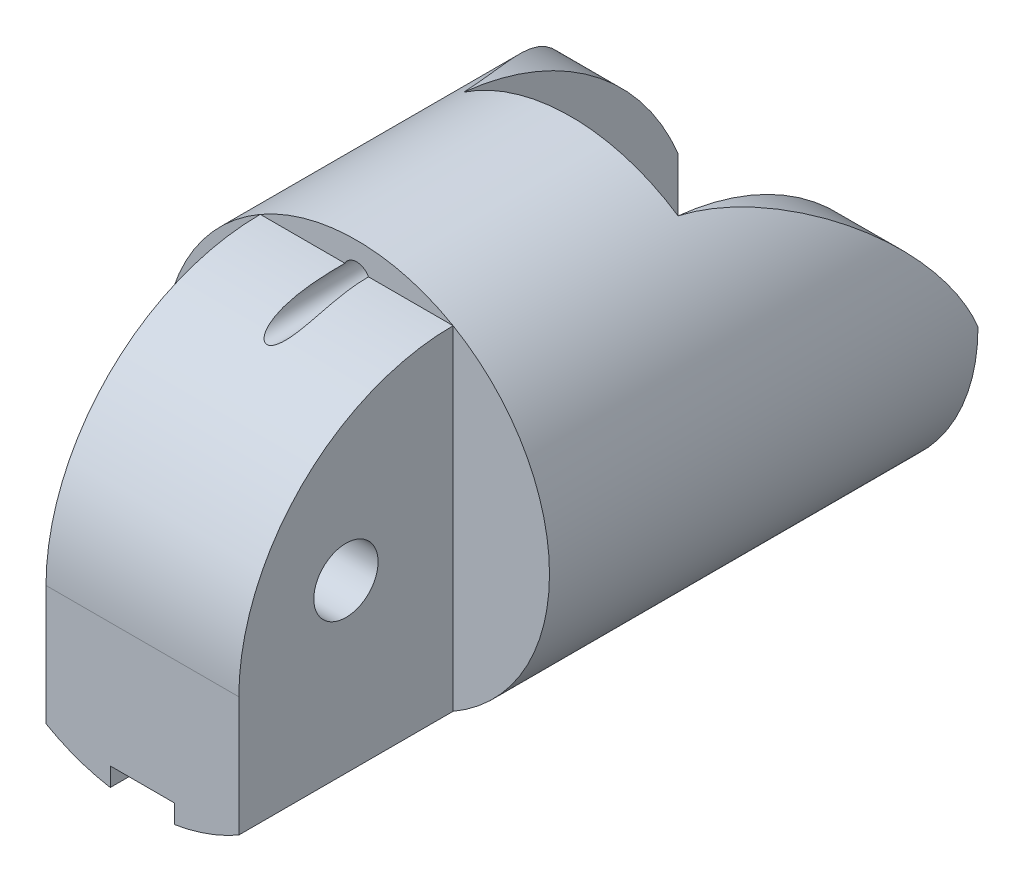
ISO-10303-21;
HEADER;
FILE_DESCRIPTION(('STEP AP214'),'2;1');
FILE_NAME('part.step','',(''),(''),'','','');
FILE_SCHEMA(('AUTOMOTIVE_DESIGN { 1 0 10303 214 1 1 1 1 }'));
ENDSEC;
DATA;
#1=APPLICATION_CONTEXT('core data for automotive mechanical design processes');
#2=APPLICATION_PROTOCOL_DEFINITION('international standard','automotive_design',2000,#1);
#3=PRODUCT_CONTEXT('',#1,'mechanical');
#4=PRODUCT('Part','Part','',(#3));
#5=PRODUCT_RELATED_PRODUCT_CATEGORY('part','',(#4));
#6=PRODUCT_DEFINITION_FORMATION('','',#4);
#7=PRODUCT_DEFINITION_CONTEXT('part definition',#1,'design');
#8=PRODUCT_DEFINITION('design','',#6,#7);
#9=PRODUCT_DEFINITION_SHAPE('','',#8);
#10=(LENGTH_UNIT() NAMED_UNIT(*) SI_UNIT(.MILLI.,.METRE.));
#11=(NAMED_UNIT(*) PLANE_ANGLE_UNIT() SI_UNIT($,.RADIAN.));
#12=(NAMED_UNIT(*) SI_UNIT($,.STERADIAN.) SOLID_ANGLE_UNIT());
#13=UNCERTAINTY_MEASURE_WITH_UNIT(LENGTH_MEASURE(1.E-05),#10,'distance_accuracy_value','');
#14=(GEOMETRIC_REPRESENTATION_CONTEXT(3) GLOBAL_UNCERTAINTY_ASSIGNED_CONTEXT((#13)) GLOBAL_UNIT_ASSIGNED_CONTEXT((#10,
#11,#12)) REPRESENTATION_CONTEXT('',''));
#15=CARTESIAN_POINT('',(0.,0.,0.));
#16=DIRECTION('',(0.,0.,1.));
#17=DIRECTION('',(1.,0.,0.));
#18=AXIS2_PLACEMENT_3D('',#15,#16,#17);
#19=CARTESIAN_POINT('',(0.,0.,0.));
#20=DIRECTION('',(0.,0.,1.));
#21=DIRECTION('',(1.,0.,0.));
#22=AXIS2_PLACEMENT_3D('',#19,#20,#21);
#23=PLANE('',#22);
#24=DIRECTION('',(0.,1.,0.));
#25=VECTOR('',#24,1.);
#26=CARTESIAN_POINT('',(4.5,7.79422863405995,0.));
#27=LINE('',#26,#25);
#28=CARTESIAN_POINT('',(4.5,-7.79422863405995,0.));
#29=VERTEX_POINT('',#28);
#30=CARTESIAN_POINT('',(4.5,7.79422863405995,0.));
#31=VERTEX_POINT('',#30);
#32=EDGE_CURVE('E219',#29,#31,#27,.T.);
#33=ORIENTED_EDGE('',*,*,#32,.F.);
#34=CARTESIAN_POINT('',(0.,0.,0.));
#35=DIRECTION('',(0.,0.,1.));
#36=DIRECTION('',(1.,0.,0.));
#37=AXIS2_PLACEMENT_3D('',#34,#35,#36);
#38=CIRCLE('',#37,9.);
#39=EDGE_CURVE('E202',#29,#31,#38,.T.);
#40=ORIENTED_EDGE('',*,*,#39,.T.);
#41=EDGE_LOOP('',(#33,#40));
#42=FACE_BOUND('',#41,.T.);
#43=ADVANCED_FACE('F40',(#42),#23,.T.);
#44=CARTESIAN_POINT('',(0.,7.5,0.));
#45=DIRECTION('',(0.,0.,1.));
#46=DIRECTION('',(1.,0.,0.));
#47=AXIS2_PLACEMENT_3D('',#44,#45,#46);
#48=CIRCLE('',#47,0.625);
#49=CARTESIAN_POINT('',(0.551411380821269,7.79422863405995,0.));
#50=VERTEX_POINT('',#49);
#51=CARTESIAN_POINT('',(-0.551411380821266,7.79422863405995,0.));
#52=VERTEX_POINT('',#51);
#53=EDGE_CURVE('E67',#50,#52,#48,.T.);
#54=ORIENTED_EDGE('',*,*,#53,.F.);
#55=DIRECTION('',(-1.,0.,0.));
#56=VECTOR('',#55,1.);
#57=CARTESIAN_POINT('',(-4.5,7.79422863405995,0.));
#58=LINE('',#57,#56);
#59=EDGE_CURVE('E226',#31,#50,#58,.T.);
#60=ORIENTED_EDGE('',*,*,#59,.F.);
#61=CARTESIAN_POINT('',(-4.5,7.79422863405995,0.));
#62=VERTEX_POINT('',#61);
#63=EDGE_CURVE('E197',#31,#62,#38,.T.);
#64=ORIENTED_EDGE('',*,*,#63,.T.);
#65=EDGE_CURVE('E229',#52,#62,#58,.T.);
#66=ORIENTED_EDGE('',*,*,#65,.F.);
#67=EDGE_LOOP('',(#54,#60,#64,#66));
#68=FACE_BOUND('',#67,.T.);
#69=ADVANCED_FACE('F290',(#68),#23,.T.);
#70=CARTESIAN_POINT('',(0.,0.,-20.));
#71=DIRECTION('',(0.,0.,1.));
#72=DIRECTION('',(1.,0.,0.));
#73=AXIS2_PLACEMENT_3D('',#70,#71,#72);
#74=PLANE('',#73);
#75=CARTESIAN_POINT('',(0.,0.,-20.));
#76=DIRECTION('',(0.,0.,1.));
#77=DIRECTION('',(1.,0.,0.));
#78=AXIS2_PLACEMENT_3D('',#75,#76,#77);
#79=CIRCLE('',#78,9.);
#80=CARTESIAN_POINT('',(-9.,0.,-20.));
#81=VERTEX_POINT('',#80);
#82=CARTESIAN_POINT('',(-5.,-7.48331477354788,-20.));
#83=VERTEX_POINT('',#82);
#84=EDGE_CURVE('E194',#81,#83,#79,.T.);
#85=ORIENTED_EDGE('',*,*,#84,.F.);
#86=DIRECTION('',(1.,0.,0.));
#87=VECTOR('',#86,1.);
#88=CARTESIAN_POINT('',(-9.,0.,-20.));
#89=LINE('',#88,#87);
#90=CARTESIAN_POINT('',(-5.,0.,-20.));
#91=VERTEX_POINT('',#90);
#92=EDGE_CURVE('E353',#81,#91,#89,.T.);
#93=ORIENTED_EDGE('',*,*,#92,.T.);
#94=DIRECTION('',(0.,-1.,0.));
#95=VECTOR('',#94,1.);
#96=CARTESIAN_POINT('',(-5.,0.,-20.));
#97=LINE('',#96,#95);
#98=EDGE_CURVE('E183',#91,#83,#97,.T.);
#99=ORIENTED_EDGE('',*,*,#98,.T.);
#100=EDGE_LOOP('',(#85,#93,#99));
#101=FACE_BOUND('',#100,.T.);
#102=ADVANCED_FACE('F287',(#101),#74,.F.);
#103=CARTESIAN_POINT('',(0.,0.,-20.));
#104=DIRECTION('',(0.,0.,1.));
#105=DIRECTION('',(1.,0.,0.));
#106=AXIS2_PLACEMENT_3D('',#103,#104,#105);
#107=CYLINDRICAL_SURFACE('',#106,9.);
#108=DIRECTION('',(0.,0.,1.));
#109=VECTOR('',#108,1.);
#110=CARTESIAN_POINT('',(-1.50000000000001,-8.87411967464942,-20.));
#111=LINE('',#110,#109);
#112=CARTESIAN_POINT('',(-1.5,-8.87411967464942,-9.99999999999999));
#113=VERTEX_POINT('',#112);
#114=CARTESIAN_POINT('',(-1.5,-8.87411967464942,10.));
#115=VERTEX_POINT('',#114);
#116=EDGE_CURVE('E166',#113,#115,#111,.T.);
#117=ORIENTED_EDGE('',*,*,#116,.T.);
#118=CARTESIAN_POINT('',(0.,0.,10.));
#119=DIRECTION('',(0.,0.,1.));
#120=DIRECTION('',(1.,0.,0.));
#121=AXIS2_PLACEMENT_3D('',#118,#119,#120);
#122=CIRCLE('',#121,9.);
#123=CARTESIAN_POINT('',(-4.5,-7.79422863405995,10.));
#124=VERTEX_POINT('',#123);
#125=EDGE_CURVE('E232',#124,#115,#122,.T.);
#126=ORIENTED_EDGE('',*,*,#125,.F.);
#127=DIRECTION('',(0.,0.,-1.));
#128=VECTOR('',#127,1.);
#129=CARTESIAN_POINT('',(-4.5,-7.79422863405995,10.));
#130=LINE('',#129,#128);
#131=CARTESIAN_POINT('',(-4.5,-7.79422863405995,0.));
#132=VERTEX_POINT('',#131);
#133=EDGE_CURVE('E211',#124,#132,#130,.T.);
#134=ORIENTED_EDGE('',*,*,#133,.T.);
#135=EDGE_CURVE('E201',#62,#132,#38,.T.);
#136=ORIENTED_EDGE('',*,*,#135,.F.);
#137=ORIENTED_EDGE('',*,*,#63,.F.);
#138=ORIENTED_EDGE('',*,*,#39,.F.);
#139=DIRECTION('',(0.,0.,-1.));
#140=VECTOR('',#139,1.);
#141=CARTESIAN_POINT('',(4.49999999999999,-7.79422863405995,10.));
#142=LINE('',#141,#140);
#143=CARTESIAN_POINT('',(4.49999999999999,-7.79422863405995,10.));
#144=VERTEX_POINT('',#143);
#145=EDGE_CURVE('E215',#144,#29,#142,.T.);
#146=ORIENTED_EDGE('',*,*,#145,.F.);
#147=CARTESIAN_POINT('',(1.5,-8.87411967464942,10.));
#148=VERTEX_POINT('',#147);
#149=EDGE_CURVE('E165',#148,#144,#122,.T.);
#150=ORIENTED_EDGE('',*,*,#149,.F.);
#151=DIRECTION('',(0.,0.,1.));
#152=VECTOR('',#151,1.);
#153=CARTESIAN_POINT('',(1.5,-8.87411967464942,-20.));
#154=LINE('',#153,#152);
#155=CARTESIAN_POINT('',(1.5,-8.87411967464942,-9.99999999999999));
#156=VERTEX_POINT('',#155);
#157=EDGE_CURVE('E147',#148,#156,#154,.F.);
#158=ORIENTED_EDGE('',*,*,#157,.T.);
#159=CARTESIAN_POINT('',(0.,0.,-9.99999999999999));
#160=DIRECTION('',(0.,0.,1.));
#161=DIRECTION('',(1.,0.,0.));
#162=AXIS2_PLACEMENT_3D('',#159,#160,#161);
#163=CIRCLE('',#162,9.);
#164=CARTESIAN_POINT('',(5.,-7.48331477354788,-9.99999999999999));
#165=VERTEX_POINT('',#164);
#166=EDGE_CURVE('E162',#165,#156,#163,.F.);
#167=ORIENTED_EDGE('',*,*,#166,.F.);
#168=DIRECTION('',(0.,0.,1.));
#169=VECTOR('',#168,1.);
#170=CARTESIAN_POINT('',(5.,-7.48331477354788,-20.));
#171=LINE('',#170,#169);
#172=CARTESIAN_POINT('',(5.,-7.48331477354788,-20.));
#173=VERTEX_POINT('',#172);
#174=EDGE_CURVE('E207',#173,#165,#171,.T.);
#175=ORIENTED_EDGE('',*,*,#174,.F.);
#176=CARTESIAN_POINT('',(9.,0.,-20.));
#177=VERTEX_POINT('',#176);
#178=EDGE_CURVE('E200',#173,#177,#79,.T.);
#179=ORIENTED_EDGE('',*,*,#178,.T.);
#180=CARTESIAN_POINT('',(5.,7.48331477354788,-9.99999999999999));
#181=CARTESIAN_POINT('',(5.04695722769121,7.45190042311866,-10.2996172869186));
#182=CARTESIAN_POINT('',(5.10926995445059,7.40969143679362,-10.5949810088159));
#183=CARTESIAN_POINT('',(5.25733312085681,7.30538723491633,-11.1750731353967));
#184=CARTESIAN_POINT('',(5.3429957334844,7.24336639128053,-11.4598369371412));
#185=CARTESIAN_POINT('',(5.53060840204013,7.10113547030839,-12.0178603202406));
#186=CARTESIAN_POINT('',(5.63250031696846,7.02098990942506,-12.2911567262015));
#187=CARTESIAN_POINT('',(5.84714234989146,6.84327366070207,-12.8279545998001));
#188=CARTESIAN_POINT('',(5.95990501909551,6.74568271693892,-13.0914442464183));
#189=CARTESIAN_POINT('',(6.22924900653958,6.49920685972285,-13.6929800677149));
#190=CARTESIAN_POINT('',(6.38814879242762,6.34396441523234,-14.0273865475614));
#191=CARTESIAN_POINT('',(6.70824294105626,6.00449798162041,-14.679939724356));
#192=CARTESIAN_POINT('',(6.86943734445374,5.82027347840154,-14.9980861327426));
#193=CARTESIAN_POINT('',(7.18771292375217,5.42234751078893,-15.6186320930584));
#194=CARTESIAN_POINT('',(7.3447855627849,5.20858985479772,-15.921000075997));
#195=CARTESIAN_POINT('',(7.64837765270438,4.75158367855932,-16.5082000078402));
#196=CARTESIAN_POINT('',(7.7949013420729,4.50834710930389,-16.793038992997));
#197=CARTESIAN_POINT('',(8.02798833617755,4.07329619974932,-17.2567605663229));
#198=CARTESIAN_POINT('',(8.11893127704699,3.88932146214518,-17.4408265783385));
#199=CARTESIAN_POINT('',(8.29104987590604,3.50746963673447,-17.7988819116345));
#200=CARTESIAN_POINT('',(8.37222600230582,3.3095932163652,-17.9728717159556));
#201=CARTESIAN_POINT('',(8.52239214904418,2.90103303410818,-18.3089858101924));
#202=CARTESIAN_POINT('',(8.59142997515175,2.69040411715162,-18.4711551052051));
#203=CARTESIAN_POINT('',(8.7155052506743,2.25631126538811,-18.7830550323717));
#204=CARTESIAN_POINT('',(8.7705471793425,2.03285146511915,-18.9327896337733));
#205=CARTESIAN_POINT('',(8.87548279360752,1.51970101646862,-19.2522592100761));
#206=CARTESIAN_POINT('',(8.92109997133178,1.22682054802406,-19.4183813164494));
#207=CARTESIAN_POINT('',(8.96780721732651,0.775554666225786,-19.649984086746));
#208=CARTESIAN_POINT('',(8.97975885671831,0.622771059427684,-19.7244079876922));
#209=CARTESIAN_POINT('',(8.99585886855247,0.313801099521741,-19.8669882576002));
#210=CARTESIAN_POINT('',(9.00000274743058,0.157612839220112,-19.9351409959026));
#211=CARTESIAN_POINT('',(9.,0.,-20.));
#212=B_SPLINE_CURVE_WITH_KNOTS('',3,(#180,#181,#182,#183,#184,#185,#186,#187,#188,#189,#190,
#191,#192,#193,#194,#195,#196,#197,#198,#199,#200,#201,#202,#203,#204,#205,#206,#207,#208,#209,
#210,#211),.UNSPECIFIED.,.F.,.F.,(4,2,2,2,2,2,2,2,2,2,2,2,2,2,2,4),(0.,0.913083387396077,
1.82277864609455,2.72928536130399,3.63685154484236,4.83974674670861,6.04266328850441,
7.24790092731937,8.45265157724037,9.27906261594473,10.1054340046936,10.9284741038282,
11.7512504643696,12.7680938412071,13.2789063726451,13.7900127999612),.UNSPECIFIED.);
#213=CARTESIAN_POINT('',(5.,7.48331477354788,-9.99999999999999));
#214=VERTEX_POINT('',#213);
#215=EDGE_CURVE('E344',#214,#177,#212,.T.);
#216=ORIENTED_EDGE('',*,*,#215,.F.);
#217=CARTESIAN_POINT('',(-5.,7.48331477354788,-9.99999999999999));
#218=VERTEX_POINT('',#217);
#219=EDGE_CURVE('E177',#218,#214,#163,.F.);
#220=ORIENTED_EDGE('',*,*,#219,.F.);
#221=CARTESIAN_POINT('',(-9.,0.,-20.));
#222=CARTESIAN_POINT('',(-9.00000128944171,0.124556049387625,-19.9487418840313));
#223=CARTESIAN_POINT('',(-8.99741393993207,0.248234218511805,-19.8954246804316));
#224=CARTESIAN_POINT('',(-8.98729429509807,0.493567441491391,-19.784815034299));
#225=CARTESIAN_POINT('',(-8.97976295303463,0.615222880717883,-19.7275233599959));
#226=CARTESIAN_POINT('',(-8.95013692194078,0.976372533446748,-19.550092777013));
#227=CARTESIAN_POINT('',(-8.9210084567569,1.21252019835042,-19.4242045652467));
#228=CARTESIAN_POINT('',(-8.84646510662349,1.67138151866654,-19.1599994714494));
#229=CARTESIAN_POINT('',(-8.80123685912472,1.89421628912042,-19.0218381002859));
#230=CARTESIAN_POINT('',(-8.696485154817,2.32830953694092,-18.7331267896915));
#231=CARTESIAN_POINT('',(-8.63695451411283,2.53956213103808,-18.5825706495992));
#232=CARTESIAN_POINT('',(-8.48993009786594,2.99871150154513,-18.2329998905971));
#233=CARTESIAN_POINT('',(-8.39915365099273,3.24329051385507,-18.0310068162767));
#234=CARTESIAN_POINT('',(-8.20249166357424,3.71266900723505,-17.6120245964465));
#235=CARTESIAN_POINT('',(-8.09660357215333,3.93746513853746,-17.3950329223388));
#236=CARTESIAN_POINT('',(-7.8725666037594,4.36829224682606,-16.9464335007309));
#237=CARTESIAN_POINT('',(-7.75435076973415,4.5742079721582,-16.7147489306906));
#238=CARTESIAN_POINT('',(-7.50956070287217,4.96586574654567,-16.2391585363449));
#239=CARTESIAN_POINT('',(-7.3829868918553,5.15160881244827,-15.9952533289542));
#240=CARTESIAN_POINT('',(-7.12181923207731,5.50721965798479,-15.4901836677989));
#241=CARTESIAN_POINT('',(-6.9871072254589,5.67661662867637,-15.2287494688638));
#242=CARTESIAN_POINT('',(-6.71621182859548,5.99467494126517,-14.6942506687809));
#243=CARTESIAN_POINT('',(-6.58002824224802,6.14333348191217,-14.4211845029314));
#244=CARTESIAN_POINT('',(-6.31120772775464,6.41915180506532,-13.8647953638566));
#245=CARTESIAN_POINT('',(-6.1785559509518,6.546420191648,-13.5815336553534));
#246=CARTESIAN_POINT('',(-5.92130626020848,6.77999472242494,-13.0030848779865));
#247=CARTESIAN_POINT('',(-5.79670620500742,6.88630645534399,-12.7079010138954));
#248=CARTESIAN_POINT('',(-5.53156841428467,7.10196227703953,-12.0264283881324));
#249=CARTESIAN_POINT('',(-5.39526101242423,7.20496035936965,-11.6363445552546));
#250=CARTESIAN_POINT('',(-5.22080555847371,7.33133762007892,-11.0351970666226));
#251=CARTESIAN_POINT('',(-5.16753223360522,7.36885156754469,-10.8314629647134));
#252=CARTESIAN_POINT('',(-5.07361764454543,7.43381200362972,-10.4191531823963));
#253=CARTESIAN_POINT('',(-5.03299968559016,7.46123993508751,-10.2105693209414));
#254=CARTESIAN_POINT('',(-5.00000000000025,7.48331477354792,-9.9999999999999));
#255=B_SPLINE_CURVE_WITH_KNOTS('',3,(#221,#222,#223,#224,#225,#226,#227,#228,#229,#230,#231,
#232,#233,#234,#235,#236,#237,#238,#239,#240,#241,#242,#243,#244,#245,#246,#247,#248,#249,#250,
#251,#252,#253,#254),.UNSPECIFIED.,.F.,.F.,(4,2,2,2,2,2,2,2,2,2,2,2,2,2,2,2,4),(0.,
0.403977756873988,0.807877644871816,1.61415855897844,2.41138172669266,3.20900616889526,
4.19737146396004,5.18590379482117,6.18011646825091,7.17427900292178,8.19160863377156,
9.20907554797486,10.2212092828174,11.2330727353767,12.5070066687481,13.1481107390264,
13.7903885374526),.UNSPECIFIED.);
#256=EDGE_CURVE('E323',#81,#218,#255,.T.);
#257=ORIENTED_EDGE('',*,*,#256,.F.);
#258=ORIENTED_EDGE('',*,*,#84,.T.);
#259=DIRECTION('',(0.,0.,1.));
#260=VECTOR('',#259,1.);
#261=CARTESIAN_POINT('',(-5.,-7.48331477354788,-20.));
#262=LINE('',#261,#260);
#263=CARTESIAN_POINT('',(-5.,-7.48331477354788,-9.99999999999999));
#264=VERTEX_POINT('',#263);
#265=EDGE_CURVE('E205',#264,#83,#262,.F.);
#266=ORIENTED_EDGE('',*,*,#265,.F.);
#267=EDGE_CURVE('E175',#113,#264,#163,.F.);
#268=ORIENTED_EDGE('',*,*,#267,.F.);
#269=EDGE_LOOP('',(#117,#126,#134,#136,#137,#138,#146,#150,#158,#167,#175,#179,#216,#220,#257,
#258,#266,#268));
#270=FACE_BOUND('',#269,.T.);
#271=CARTESIAN_POINT('',(-9.,0.,-17.5));
#272=CARTESIAN_POINT('',(-8.99999856701294,-0.0836345429749291,-17.4999966466313));
#273=CARTESIAN_POINT('',(-8.9988220674782,-0.167314729103293,-17.4929816350187));
#274=CARTESIAN_POINT('',(-8.99424206964832,-0.332328133003826,-17.4651186047408));
#275=CARTESIAN_POINT('',(-8.99083652354334,-0.413659120775549,-17.444257865853));
#276=CARTESIAN_POINT('',(-8.9821804094187,-0.571562848327588,-17.3893507308444));
#277=CARTESIAN_POINT('',(-8.97693135095516,-0.648139421059142,-17.3553151206157));
#278=CARTESIAN_POINT('',(-8.96516536249242,-0.794485105186769,-17.2750526247686));
#279=CARTESIAN_POINT('',(-8.9586485775266,-0.864254993927156,-17.2288271335102));
#280=CARTESIAN_POINT('',(-8.94499990474988,-0.99568356857501,-17.1250269497077));
#281=CARTESIAN_POINT('',(-8.93786323088914,-1.05726774212098,-17.0673585312183));
#282=CARTESIAN_POINT('',(-8.92381576126039,-1.16993309919596,-16.9425112189163));
#283=CARTESIAN_POINT('',(-8.916904979776,-1.22101361963459,-16.875331725126));
#284=CARTESIAN_POINT('',(-8.90404539455868,-1.31152027536308,-16.7328574202818));
#285=CARTESIAN_POINT('',(-8.89810277454981,-1.3508727317166,-16.6575151979171));
#286=CARTESIAN_POINT('',(-8.88791873876805,-1.41633501924674,-16.5011742614196));
#287=CARTESIAN_POINT('',(-8.88367720808584,-1.44244574493937,-16.4201759297934));
#288=CARTESIAN_POINT('',(-8.87742322105653,-1.48044862667089,-16.2556118350861));
#289=CARTESIAN_POINT('',(-8.8753906109142,-1.49246941748124,-16.1720765580992));
#290=CARTESIAN_POINT('',(-8.87372363361989,-1.50235003517393,-16.0041518338699));
#291=CARTESIAN_POINT('',(-8.87408909674328,-1.5002108642334,-15.9197624474996));
#292=CARTESIAN_POINT('',(-8.87715857318133,-1.4819370590377,-15.7534432832347));
#293=CARTESIAN_POINT('',(-8.8798384399135,-1.46594692913387,-15.6714971178729));
#294=CARTESIAN_POINT('',(-8.88719697126605,-1.42065188424207,-15.5114672093025));
#295=CARTESIAN_POINT('',(-8.89187570443963,-1.39134651259185,-15.4333835986669));
#296=CARTESIAN_POINT('',(-8.9027308760046,-1.32010634765635,-15.2828627059354));
#297=CARTESIAN_POINT('',(-8.90891440264395,-1.27811154832783,-15.2104543563513));
#298=CARTESIAN_POINT('',(-8.92207751049005,-1.18272721053446,-15.073657359677));
#299=CARTESIAN_POINT('',(-8.92905715592572,-1.12933675239258,-15.009269360527));
#300=CARTESIAN_POINT('',(-8.94313216727871,-1.01188932729544,-14.8895043485156));
#301=CARTESIAN_POINT('',(-8.95022789538991,-0.947708378323879,-14.8342488888759));
#302=CARTESIAN_POINT('',(-8.96365560838034,-0.81092114938899,-14.7352733424008));
#303=CARTESIAN_POINT('',(-8.96998758833847,-0.738314815143855,-14.6915533298901));
#304=CARTESIAN_POINT('',(-8.98118335735747,-0.586623549700029,-14.6168786637182));
#305=CARTESIAN_POINT('',(-8.98604591044468,-0.507533235338799,-14.5859347484012));
#306=CARTESIAN_POINT('',(-8.99374501807596,-0.345179007361641,-14.5378034708524));
#307=CARTESIAN_POINT('',(-8.99658174210284,-0.261915443507682,-14.5206149578158));
#308=CARTESIAN_POINT('',(-8.99988677905612,-0.0946259407809752,-14.5006471849233));
#309=CARTESIAN_POINT('',(-9.00038251807671,-0.0106204422906077,-14.4977010569166));
#310=CARTESIAN_POINT('',(-8.99902484652702,0.156683863733932,-14.5058568066569));
#311=CARTESIAN_POINT('',(-8.99717152634471,0.239982698335223,-14.5169581438802));
#312=CARTESIAN_POINT('',(-8.99134096162921,0.402993705328059,-14.5527549096013));
#313=CARTESIAN_POINT('',(-8.98737662880787,0.482724521031229,-14.5773677250341));
#314=CARTESIAN_POINT('',(-8.97776678673215,0.636928130916267,-14.6394007109197));
#315=CARTESIAN_POINT('',(-8.97212118307212,0.711400629545832,-14.6768216005812));
#316=CARTESIAN_POINT('',(-8.95970709781444,0.853698413681376,-14.7637906748181));
#317=CARTESIAN_POINT('',(-8.95292913532213,0.92145915056229,-14.8134430937003));
#318=CARTESIAN_POINT('',(-8.93903080435141,1.04774615130161,-14.923322389231));
#319=CARTESIAN_POINT('',(-8.93191041102928,1.10627174381795,-14.983550033966));
#320=CARTESIAN_POINT('',(-8.91804105141507,1.2130456677948,-15.1136185288429));
#321=CARTESIAN_POINT('',(-8.91129669682263,1.26118125666823,-15.1835524993086));
#322=CARTESIAN_POINT('',(-8.8990291786673,1.34502138617699,-15.3306117814831));
#323=CARTESIAN_POINT('',(-8.89350597639612,1.3807263208619,-15.4077368651365));
#324=CARTESIAN_POINT('',(-8.88434072218623,1.43852299888389,-15.5666738396873));
#325=CARTESIAN_POINT('',(-8.88069092586639,1.46067085952877,-15.6484648570183));
#326=CARTESIAN_POINT('',(-8.87566630101156,1.49090127226697,-15.8146720775331));
#327=CARTESIAN_POINT('',(-8.87429127469633,1.4989850471677,-15.8990880518392));
#328=CARTESIAN_POINT('',(-8.87398039850406,1.50082371962842,-16.0670230995774));
#329=CARTESIAN_POINT('',(-8.87501433903389,1.49475608167512,-16.1505402271452));
#330=CARTESIAN_POINT('',(-8.87933868872237,1.46884790337411,-16.3153475488305));
#331=CARTESIAN_POINT('',(-8.88262909056728,1.44900740766749,-16.3966377501651));
#332=CARTESIAN_POINT('',(-8.89108413769031,1.39618469375694,-16.5546150623756));
#333=CARTESIAN_POINT('',(-8.89624660331802,1.36321775436027,-16.6313074060336));
#334=CARTESIAN_POINT('',(-8.90786621353324,1.28509620234955,-16.7781014015169));
#335=CARTESIAN_POINT('',(-8.91432342233039,1.23994098524914,-16.8482027262233));
#336=CARTESIAN_POINT('',(-8.92790072427373,1.1380913306233,-16.9807213498647));
#337=CARTESIAN_POINT('',(-8.93502777345781,1.08126633815619,-17.0430376100202));
#338=CARTESIAN_POINT('',(-8.94908623416504,0.957965418828141,-17.157310962685));
#339=CARTESIAN_POINT('',(-8.95601760015928,0.891487267747584,-17.2092656611829));
#340=CARTESIAN_POINT('',(-8.96895917785332,0.75022150178417,-17.30166896092));
#341=CARTESIAN_POINT('',(-8.97496269751863,0.675379672519693,-17.3420356235878));
#342=CARTESIAN_POINT('',(-8.98530700561065,0.51990784162739,-17.409561690766));
#343=CARTESIAN_POINT('',(-8.98964944906489,0.439283696898007,-17.4367342486478));
#344=CARTESIAN_POINT('',(-8.99523474499773,0.298621986027241,-17.471203164476));
#345=CARTESIAN_POINT('',(-8.99701216364015,0.239435298179069,-17.4819846817696));
#346=CARTESIAN_POINT('',(-8.99939529591672,0.120173586191885,-17.4963842427069));
#347=CARTESIAN_POINT('',(-9.00000102972385,0.0600985773650964,-17.5000024096824));
#348=CARTESIAN_POINT('',(-9.,0.,-17.5));
#349=B_SPLINE_CURVE_WITH_KNOTS('',3,(#271,#272,#273,#274,#275,#276,#277,#278,#279,#280,#281,
#282,#283,#284,#285,#286,#287,#288,#289,#290,#291,#292,#293,#294,#295,#296,#297,#298,#299,#300,
#301,#302,#303,#304,#305,#306,#307,#308,#309,#310,#311,#312,#313,#314,#315,#316,#317,#318,#319,
#320,#321,#322,#323,#324,#325,#326,#327,#328,#329,#330,#331,#332,#333,#334,#335,#336,#337,#338,
#339,#340,#341,#342,#343,#344,#345,#346,#347,#348),.UNSPECIFIED.,.T.,.F.,(4,2,2,2,2,2,2,2,2,2,2,
2,2,2,2,2,2,2,2,2,2,2,2,2,2,2,2,2,2,2,2,2,2,2,2,2,2,2,4),(0.,0.250683950963106,
0.501598527417253,0.752308120215163,1.00298904760488,1.255814946374,1.50865680101915,
1.76305512494304,2.01743626125709,2.26947646262055,2.52149882592532,2.77092313056246,
3.0203559901523,3.27098733979535,3.52163892408345,3.77539661946797,4.0291559498151,
4.28312813349543,4.53707906712691,4.7880473009484,5.03900587821517,5.28844684203851,
5.53790181495641,5.78956095376216,6.04123837832571,6.29552293204573,6.54979942425568,
6.80301613405065,7.05621082671973,7.30624745713622,7.55628327712882,7.80602890935736,
8.05578693017604,8.30850830516037,8.56128800327386,8.81581338964322,9.07008451278045,
9.25022548898414,9.43036336366183),.UNSPECIFIED.);
#350=CARTESIAN_POINT('',(-9.,0.,-17.5));
#351=VERTEX_POINT('',#350);
#352=EDGE_CURVE('E236',#351,#351,#349,.T.);
#353=ORIENTED_EDGE('',*,*,#352,.F.);
#354=EDGE_LOOP('',(#353));
#355=FACE_BOUND('',#354,.T.);
#356=ADVANCED_FACE('F159',(#270,#355),#107,.T.);
#357=DIRECTION('',(0.,1.,0.));
#358=VECTOR('',#357,1.);
#359=CARTESIAN_POINT('',(5.,0.,-20.));
#360=LINE('',#359,#358);
#361=CARTESIAN_POINT('',(5.,0.,-20.));
#362=VERTEX_POINT('',#361);
#363=EDGE_CURVE('E187',#173,#362,#360,.T.);
#364=ORIENTED_EDGE('',*,*,#363,.T.);
#365=EDGE_CURVE('E355',#362,#177,#89,.T.);
#366=ORIENTED_EDGE('',*,*,#365,.T.);
#367=ORIENTED_EDGE('',*,*,#178,.F.);
#368=EDGE_LOOP('',(#364,#366,#367));
#369=FACE_BOUND('',#368,.T.);
#370=ADVANCED_FACE('F284',(#369),#74,.F.);
#371=DIRECTION('',(0.,-1.,0.));
#372=VECTOR('',#371,1.);
#373=CARTESIAN_POINT('',(-4.5,7.79422863405995,0.));
#374=LINE('',#373,#372);
#375=EDGE_CURVE('E223',#62,#132,#374,.T.);
#376=ORIENTED_EDGE('',*,*,#375,.F.);
#377=ORIENTED_EDGE('',*,*,#135,.T.);
#378=EDGE_LOOP('',(#376,#377));
#379=FACE_BOUND('',#378,.T.);
#380=ADVANCED_FACE('F282',(#379),#23,.T.);
#381=CARTESIAN_POINT('',(-5.,-9.,-20.));
#382=DIRECTION('',(-1.,0.,0.));
#383=DIRECTION('',(0.,0.,1.));
#384=AXIS2_PLACEMENT_3D('',#381,#382,#383);
#385=PLANE('',#384);
#386=CARTESIAN_POINT('',(-5.,0.,-16.));
#387=DIRECTION('',(-1.,0.,0.));
#388=DIRECTION('',(0.,0.,1.));
#389=AXIS2_PLACEMENT_3D('',#386,#387,#388);
#390=CIRCLE('',#389,1.5);
#391=CARTESIAN_POINT('',(-5.,0.,-14.5));
#392=VERTEX_POINT('',#391);
#393=EDGE_CURVE('E243',#392,#392,#390,.T.);
#394=ORIENTED_EDGE('',*,*,#393,.T.);
#395=EDGE_LOOP('',(#394));
#396=FACE_BOUND('',#395,.T.);
#397=ORIENTED_EDGE('',*,*,#98,.F.);
#398=CARTESIAN_POINT('',(-5.,-4.63867001801231,-8.72873721245948));
#399=DIRECTION('',(-1.,0.,0.));
#400=DIRECTION('',(0.,0.,1.));
#401=AXIS2_PLACEMENT_3D('',#398,#399,#400);
#402=CIRCLE('',#401,12.1884627563037);
#403=EDGE_CURVE('E327',#91,#218,#402,.F.);
#404=ORIENTED_EDGE('',*,*,#403,.T.);
#405=DIRECTION('',(0.,1.,0.));
#406=VECTOR('',#405,1.);
#407=CARTESIAN_POINT('',(-5.,-9.,-9.99999999999999));
#408=LINE('',#407,#406);
#409=EDGE_CURVE('E209',#264,#218,#408,.T.);
#410=ORIENTED_EDGE('',*,*,#409,.F.);
#411=ORIENTED_EDGE('',*,*,#265,.T.);
#412=EDGE_LOOP('',(#397,#404,#410,#411));
#413=FACE_BOUND('',#412,.T.);
#414=ADVANCED_FACE('F275',(#396,#413),#385,.F.);
#415=CARTESIAN_POINT('',(5.,-9.,-20.));
#416=DIRECTION('',(1.,0.,0.));
#417=DIRECTION('',(0.,0.,-1.));
#418=AXIS2_PLACEMENT_3D('',#415,#416,#417);
#419=PLANE('',#418);
#420=CARTESIAN_POINT('',(5.,0.,-16.));
#421=DIRECTION('',(1.,0.,0.));
#422=DIRECTION('',(0.,0.,-1.));
#423=AXIS2_PLACEMENT_3D('',#420,#421,#422);
#424=CIRCLE('',#423,1.5);
#425=CARTESIAN_POINT('',(5.,0.,-17.5));
#426=VERTEX_POINT('',#425);
#427=EDGE_CURVE('E314',#426,#426,#424,.T.);
#428=ORIENTED_EDGE('',*,*,#427,.T.);
#429=EDGE_LOOP('',(#428));
#430=FACE_BOUND('',#429,.T.);
#431=DIRECTION('',(0.,1.,0.));
#432=VECTOR('',#431,1.);
#433=CARTESIAN_POINT('',(5.,-9.,-9.99999999999999));
#434=LINE('',#433,#432);
#435=EDGE_CURVE('E173',#165,#214,#434,.T.);
#436=ORIENTED_EDGE('',*,*,#435,.T.);
#437=CARTESIAN_POINT('',(5.,-4.63867001801231,-8.72873721245948));
#438=DIRECTION('',(1.,0.,0.));
#439=DIRECTION('',(0.,0.,-1.));
#440=AXIS2_PLACEMENT_3D('',#437,#438,#439);
#441=CIRCLE('',#440,12.1884627563037);
#442=EDGE_CURVE('E350',#214,#362,#441,.F.);
#443=ORIENTED_EDGE('',*,*,#442,.T.);
#444=ORIENTED_EDGE('',*,*,#363,.F.);
#445=ORIENTED_EDGE('',*,*,#174,.T.);
#446=EDGE_LOOP('',(#436,#443,#444,#445));
#447=FACE_BOUND('',#446,.T.);
#448=ADVANCED_FACE('F272',(#430,#447),#419,.F.);
#449=CARTESIAN_POINT('',(5.,-9.,-9.99999999999999));
#450=DIRECTION('',(0.,0.,1.));
#451=DIRECTION('',(1.,0.,0.));
#452=AXIS2_PLACEMENT_3D('',#449,#450,#451);
#453=PLANE('',#452);
#454=CARTESIAN_POINT('',(0.,7.5,-9.99999999999999));
#455=DIRECTION('',(0.,0.,1.));
#456=DIRECTION('',(1.,0.,0.));
#457=AXIS2_PLACEMENT_3D('',#454,#455,#456);
#458=CIRCLE('',#457,0.625);
#459=CARTESIAN_POINT('',(0.625000000000002,7.5,-9.99999999999999));
#460=VERTEX_POINT('',#459);
#461=EDGE_CURVE('E303',#460,#460,#458,.T.);
#462=ORIENTED_EDGE('',*,*,#461,.T.);
#463=EDGE_LOOP('',(#462));
#464=FACE_BOUND('',#463,.T.);
#465=DIRECTION('',(1.,0.,0.));
#466=VECTOR('',#465,1.);
#467=CARTESIAN_POINT('',(1.5,-8.,-9.99999999999999));
#468=LINE('',#467,#466);
#469=CARTESIAN_POINT('',(-1.5,-8.,-9.99999999999999));
#470=VERTEX_POINT('',#469);
#471=CARTESIAN_POINT('',(1.5,-8.,-9.99999999999999));
#472=VERTEX_POINT('',#471);
#473=EDGE_CURVE('E154',#470,#472,#468,.T.);
#474=ORIENTED_EDGE('',*,*,#473,.F.);
#475=DIRECTION('',(0.,1.,0.));
#476=VECTOR('',#475,1.);
#477=CARTESIAN_POINT('',(-1.5,-10.,-9.99999999999999));
#478=LINE('',#477,#476);
#479=EDGE_CURVE('E363',#113,#470,#478,.T.);
#480=ORIENTED_EDGE('',*,*,#479,.F.);
#481=ORIENTED_EDGE('',*,*,#267,.T.);
#482=ORIENTED_EDGE('',*,*,#409,.T.);
#483=ORIENTED_EDGE('',*,*,#219,.T.);
#484=ORIENTED_EDGE('',*,*,#435,.F.);
#485=ORIENTED_EDGE('',*,*,#166,.T.);
#486=DIRECTION('',(0.,-1.,0.));
#487=VECTOR('',#486,1.);
#488=CARTESIAN_POINT('',(1.5,-10.,-9.99999999999999));
#489=LINE('',#488,#487);
#490=EDGE_CURVE('E144',#472,#156,#489,.T.);
#491=ORIENTED_EDGE('',*,*,#490,.F.);
#492=EDGE_LOOP('',(#474,#480,#481,#482,#483,#484,#485,#491));
#493=FACE_BOUND('',#492,.T.);
#494=ADVANCED_FACE('F170',(#464,#493),#453,.F.);
#495=CARTESIAN_POINT('',(-4.5,7.79422863405995,10.));
#496=DIRECTION('',(1.,0.,0.));
#497=DIRECTION('',(0.,0.,-1.));
#498=AXIS2_PLACEMENT_3D('',#495,#496,#497);
#499=PLANE('',#498);
#500=CARTESIAN_POINT('',(-4.5,0.,5.));
#501=DIRECTION('',(1.,0.,0.));
#502=DIRECTION('',(0.,0.,-1.));
#503=AXIS2_PLACEMENT_3D('',#500,#501,#502);
#504=CIRCLE('',#503,1.5);
#505=CARTESIAN_POINT('',(-4.5,0.,3.5));
#506=VERTEX_POINT('',#505);
#507=EDGE_CURVE('E316',#506,#506,#504,.T.);
#508=ORIENTED_EDGE('',*,*,#507,.T.);
#509=EDGE_LOOP('',(#508));
#510=FACE_BOUND('',#509,.T.);
#511=DIRECTION('',(0.,-1.,0.));
#512=VECTOR('',#511,1.);
#513=CARTESIAN_POINT('',(-4.5,7.79422863405995,10.));
#514=LINE('',#513,#512);
#515=CARTESIAN_POINT('',(-4.5,-2.20577136594005,10.));
#516=VERTEX_POINT('',#515);
#517=EDGE_CURVE('E222',#516,#124,#514,.T.);
#518=ORIENTED_EDGE('',*,*,#517,.F.);
#519=CARTESIAN_POINT('',(-4.5,-2.20577136594005,0.));
#520=DIRECTION('',(1.,0.,0.));
#521=DIRECTION('',(0.,0.,-1.));
#522=AXIS2_PLACEMENT_3D('',#519,#520,#521);
#523=CIRCLE('',#522,10.);
#524=EDGE_CURVE('E179',#516,#62,#523,.F.);
#525=ORIENTED_EDGE('',*,*,#524,.T.);
#526=ORIENTED_EDGE('',*,*,#375,.T.);
#527=ORIENTED_EDGE('',*,*,#133,.F.);
#528=EDGE_LOOP('',(#518,#525,#526,#527));
#529=FACE_BOUND('',#528,.T.);
#530=ADVANCED_FACE('F267',(#510,#529),#499,.F.);
#531=CARTESIAN_POINT('',(4.5,7.79422863405995,10.));
#532=DIRECTION('',(-1.,0.,0.));
#533=DIRECTION('',(0.,0.,1.));
#534=AXIS2_PLACEMENT_3D('',#531,#532,#533);
#535=PLANE('',#534);
#536=CARTESIAN_POINT('',(4.5,0.,5.));
#537=DIRECTION('',(-1.,0.,0.));
#538=DIRECTION('',(0.,0.,1.));
#539=AXIS2_PLACEMENT_3D('',#536,#537,#538);
#540=CIRCLE('',#539,1.5);
#541=CARTESIAN_POINT('',(4.5,0.,6.5));
#542=VERTEX_POINT('',#541);
#543=EDGE_CURVE('E317',#542,#542,#540,.T.);
#544=ORIENTED_EDGE('',*,*,#543,.T.);
#545=EDGE_LOOP('',(#544));
#546=FACE_BOUND('',#545,.T.);
#547=ORIENTED_EDGE('',*,*,#32,.T.);
#548=CARTESIAN_POINT('',(4.5,-2.20577136594005,0.));
#549=DIRECTION('',(-1.,0.,0.));
#550=DIRECTION('',(0.,0.,1.));
#551=AXIS2_PLACEMENT_3D('',#548,#549,#550);
#552=CIRCLE('',#551,10.);
#553=CARTESIAN_POINT('',(4.5,-2.20577136594005,10.));
#554=VERTEX_POINT('',#553);
#555=EDGE_CURVE('E54',#31,#554,#552,.F.);
#556=ORIENTED_EDGE('',*,*,#555,.T.);
#557=DIRECTION('',(0.,1.,0.));
#558=VECTOR('',#557,1.);
#559=CARTESIAN_POINT('',(4.5,7.79422863405995,10.));
#560=LINE('',#559,#558);
#561=EDGE_CURVE('E218',#144,#554,#560,.T.);
#562=ORIENTED_EDGE('',*,*,#561,.F.);
#563=ORIENTED_EDGE('',*,*,#145,.T.);
#564=EDGE_LOOP('',(#547,#556,#562,#563));
#565=FACE_BOUND('',#564,.T.);
#566=ADVANCED_FACE('F263',(#546,#565),#535,.F.);
#567=CARTESIAN_POINT('',(0.,0.,10.));
#568=DIRECTION('',(0.,0.,1.));
#569=DIRECTION('',(1.,0.,0.));
#570=AXIS2_PLACEMENT_3D('',#567,#568,#569);
#571=PLANE('',#570);
#572=DIRECTION('',(0.,1.,0.));
#573=VECTOR('',#572,1.);
#574=CARTESIAN_POINT('',(-1.5,-10.,10.));
#575=LINE('',#574,#573);
#576=CARTESIAN_POINT('',(-1.5,-8.,10.));
#577=VERTEX_POINT('',#576);
#578=EDGE_CURVE('E366',#115,#577,#575,.T.);
#579=ORIENTED_EDGE('',*,*,#578,.T.);
#580=DIRECTION('',(1.,0.,0.));
#581=VECTOR('',#580,1.);
#582=CARTESIAN_POINT('',(1.5,-8.,10.));
#583=LINE('',#582,#581);
#584=CARTESIAN_POINT('',(1.5,-8.,10.));
#585=VERTEX_POINT('',#584);
#586=EDGE_CURVE('E304',#577,#585,#583,.T.);
#587=ORIENTED_EDGE('',*,*,#586,.T.);
#588=DIRECTION('',(0.,-1.,0.));
#589=VECTOR('',#588,1.);
#590=CARTESIAN_POINT('',(1.5,-10.,10.));
#591=LINE('',#590,#589);
#592=EDGE_CURVE('E61',#585,#148,#591,.T.);
#593=ORIENTED_EDGE('',*,*,#592,.T.);
#594=ORIENTED_EDGE('',*,*,#149,.T.);
#595=ORIENTED_EDGE('',*,*,#561,.T.);
#596=DIRECTION('',(-1.,0.,0.));
#597=VECTOR('',#596,1.);
#598=CARTESIAN_POINT('',(-4.5,-2.20577136594005,10.));
#599=LINE('',#598,#597);
#600=EDGE_CURVE('E174',#554,#516,#599,.T.);
#601=ORIENTED_EDGE('',*,*,#600,.T.);
#602=ORIENTED_EDGE('',*,*,#517,.T.);
#603=ORIENTED_EDGE('',*,*,#125,.T.);
#604=EDGE_LOOP('',(#579,#587,#593,#594,#595,#601,#602,#603));
#605=FACE_BOUND('',#604,.T.);
#606=ADVANCED_FACE('F260',(#605),#571,.T.);
#607=CARTESIAN_POINT('',(-9.,0.,5.));
#608=DIRECTION('',(1.,0.,0.));
#609=DIRECTION('',(0.,0.,-1.));
#610=AXIS2_PLACEMENT_3D('',#607,#608,#609);
#611=CYLINDRICAL_SURFACE('',#610,1.5);
#612=ORIENTED_EDGE('',*,*,#543,.F.);
#613=EDGE_LOOP('',(#612));
#614=FACE_BOUND('',#613,.T.);
#615=ORIENTED_EDGE('',*,*,#507,.F.);
#616=EDGE_LOOP('',(#615));
#617=FACE_BOUND('',#616,.T.);
#618=ADVANCED_FACE('F254',(#614,#617),#611,.F.);
#619=CARTESIAN_POINT('',(8.,0.,-16.));
#620=DIRECTION('',(1.,0.,0.));
#621=DIRECTION('',(0.,0.,-1.));
#622=AXIS2_PLACEMENT_3D('',#619,#620,#621);
#623=PLANE('',#622);
#624=CARTESIAN_POINT('',(8.,0.,-16.));
#625=DIRECTION('',(1.,0.,0.));
#626=DIRECTION('',(0.,0.,-1.));
#627=AXIS2_PLACEMENT_3D('',#624,#625,#626);
#628=CIRCLE('',#627,1.5);
#629=CARTESIAN_POINT('',(8.,0.,-17.5));
#630=VERTEX_POINT('',#629);
#631=EDGE_CURVE('E319',#630,#630,#628,.T.);
#632=ORIENTED_EDGE('',*,*,#631,.F.);
#633=EDGE_LOOP('',(#632));
#634=FACE_BOUND('',#633,.T.);
#635=ADVANCED_FACE('F256',(#634),#623,.F.);
#636=CARTESIAN_POINT('',(-9.,0.,-16.));
#637=DIRECTION('',(1.,0.,0.));
#638=DIRECTION('',(0.,0.,-1.));
#639=AXIS2_PLACEMENT_3D('',#636,#637,#638);
#640=CYLINDRICAL_SURFACE('',#639,1.5);
#641=ORIENTED_EDGE('',*,*,#631,.T.);
#642=EDGE_LOOP('',(#641));
#643=FACE_BOUND('',#642,.T.);
#644=ORIENTED_EDGE('',*,*,#427,.F.);
#645=EDGE_LOOP('',(#644));
#646=FACE_BOUND('',#645,.T.);
#647=ADVANCED_FACE('F252',(#643,#646),#640,.F.);
#648=ORIENTED_EDGE('',*,*,#352,.T.);
#649=EDGE_LOOP('',(#648));
#650=FACE_BOUND('',#649,.T.);
#651=ORIENTED_EDGE('',*,*,#393,.F.);
#652=EDGE_LOOP('',(#651));
#653=FACE_BOUND('',#652,.T.);
#654=ADVANCED_FACE('F247',(#650,#653),#640,.F.);
#655=CARTESIAN_POINT('',(0.,-2.20577136594005,0.));
#656=DIRECTION('',(1.,0.,0.));
#657=DIRECTION('',(0.,0.,-1.));
#658=AXIS2_PLACEMENT_3D('',#655,#656,#657);
#659=CYLINDRICAL_SURFACE('',#658,10.);
#660=CARTESIAN_POINT('',(-0.551411380821266,7.79422863405995,0.));
#661=CARTESIAN_POINT('',(-0.551373863101425,7.79422959150468,0.104267225227585));
#662=CARTESIAN_POINT('',(-0.552280963238751,7.79259792899179,0.208529716505634));
#663=CARTESIAN_POINT('',(-0.555705881876066,7.7860774105822,0.416915290686543));
#664=CARTESIAN_POINT('',(-0.558223518994026,7.78118892147352,0.521038387965129));
#665=CARTESIAN_POINT('',(-0.564605529309953,7.7681332980376,0.729509743929232));
#666=CARTESIAN_POINT('',(-0.568475949708641,7.75995141628215,0.833856886899376));
#667=CARTESIAN_POINT('',(-0.577048931137325,7.74032125672933,1.04220475428242));
#668=CARTESIAN_POINT('',(-0.581751487299916,7.72887299803771,1.14620548071799));
#669=CARTESIAN_POINT('',(-0.593847529894311,7.69600313329381,1.40710060274305));
#670=CARTESIAN_POINT('',(-0.601382671858257,7.67247904663428,1.56372880472756));
#671=CARTESIAN_POINT('',(-0.614400373375069,7.61798882791806,1.87586100780043));
#672=CARTESIAN_POINT('',(-0.619881787429104,7.58701855839861,2.0313643341954));
#673=CARTESIAN_POINT('',(-0.625718085045995,7.51777128875946,2.34045027611937));
#674=CARTESIAN_POINT('',(-0.62608699826595,7.47951457697228,2.49403699199215));
#675=CARTESIAN_POINT('',(-0.619784999243948,7.41676944853891,2.72267393980298));
#676=CARTESIAN_POINT('',(-0.616544915787857,7.39497261377851,2.79856032448049));
#677=CARTESIAN_POINT('',(-0.607088687217976,7.34964374501014,2.94961929136679));
#678=CARTESIAN_POINT('',(-0.60087334101737,7.32611217824403,3.02479205967191));
#679=CARTESIAN_POINT('',(-0.586567202109002,7.28334359034256,3.15598311540881));
#680=CARTESIAN_POINT('',(-0.579302589398476,7.26445752996084,3.21220484032374));
#681=CARTESIAN_POINT('',(-0.562045007895566,7.22581149837636,3.32396469399134));
#682=CARTESIAN_POINT('',(-0.552050745678145,7.20605111661177,3.37950248559589));
#683=CARTESIAN_POINT('',(-0.528634364191681,7.16576125430441,3.48967294370354));
#684=CARTESIAN_POINT('',(-0.515207899508807,7.14523082715472,3.54430436861298));
#685=CARTESIAN_POINT('',(-0.483973012371374,7.10367829685238,3.65205141283509));
#686=CARTESIAN_POINT('',(-0.46616954107943,7.08265677336365,3.70516866969636));
#687=CARTESIAN_POINT('',(-0.424494341253098,7.04029241786096,3.80965727499637));
#688=CARTESIAN_POINT('',(-0.400566389565853,7.01894843310331,3.86100715615392));
#689=CARTESIAN_POINT('',(-0.358427186471836,6.98769843182326,3.93456814427629));
#690=CARTESIAN_POINT('',(-0.343395966072827,6.97744018170517,3.95844217796835));
#691=CARTESIAN_POINT('',(-0.310790010508739,6.95741161031191,4.00458538681799));
#692=CARTESIAN_POINT('',(-0.293219961129599,6.94764043380655,4.02685740771007));
#693=CARTESIAN_POINT('',(-0.261345450804052,6.93208802743217,4.06199016231864));
#694=CARTESIAN_POINT('',(-0.24789954853539,6.92606096762379,4.0755166263602));
#695=CARTESIAN_POINT('',(-0.219428198771377,6.91458370403933,4.10113641660192));
#696=CARTESIAN_POINT('',(-0.204401065465143,6.9091341286183,4.11322818339942));
#697=CARTESIAN_POINT('',(-0.172480324448738,6.89903515802145,4.13553499540872));
#698=CARTESIAN_POINT('',(-0.155568533691487,6.89439490850486,4.14572866893104));
#699=CARTESIAN_POINT('',(-0.120060933144782,6.88637237837224,4.16329390757907));
#700=CARTESIAN_POINT('',(-0.101469334801394,6.88298705471203,4.17067230071219));
#701=CARTESIAN_POINT('',(-0.0678092677234198,6.8785186797828,4.18039419518238));
#702=CARTESIAN_POINT('',(-0.0530207826239805,6.87707177103862,4.18353498758026));
#703=CARTESIAN_POINT('',(-0.023072023182802,6.87524642418712,4.18749578695861));
#704=CARTESIAN_POINT('',(-0.00791203586727279,6.87486718590406,4.18831753197226));
#705=CARTESIAN_POINT('',(0.0223407187161961,6.87521609156852,4.18756097098623));
#706=CARTESIAN_POINT('',(0.0374334497411605,6.87594477370288,4.18598149856385));
#707=CARTESIAN_POINT('',(0.0671213783362296,6.87843558570143,4.18057324311853));
#708=CARTESIAN_POINT('',(0.0817161657108836,6.88019854682212,4.17674265085228));
#709=CARTESIAN_POINT('',(0.114323077727101,6.88526234198282,4.16571151666744));
#710=CARTESIAN_POINT('',(0.132062106190532,6.88886447627139,4.15784785627243));
#711=CARTESIAN_POINT('',(0.165921292858367,6.89717263284997,4.13962693621841));
#712=CARTESIAN_POINT('',(0.18203795925532,6.90188096638805,4.12926445441067));
#713=CARTESIAN_POINT('',(0.221700190521484,6.91507732912202,4.10006116953361));
#714=CARTESIAN_POINT('',(0.244011695791875,6.92415534982729,4.07982757046402));
#715=CARTESIAN_POINT('',(0.285146017548005,6.94337296439694,4.03654857394381));
#716=CARTESIAN_POINT('',(0.303959658560154,6.95351524405322,4.01349603709872));
#717=CARTESIAN_POINT('',(0.338551410691133,6.97425362745257,3.96583037359684));
#718=CARTESIAN_POINT('',(0.354357988084798,6.98484418061821,3.94123515226884));
#719=CARTESIAN_POINT('',(0.383688283905382,7.00630117023451,3.89081894195124));
#720=CARTESIAN_POINT('',(0.397209688815373,7.01716787361174,3.86499674424074));
#721=CARTESIAN_POINT('',(0.422372797672898,7.03901829530512,3.81243702305509));
#722=CARTESIAN_POINT('',(0.434010640913225,7.05000220597346,3.78569775240746));
#723=CARTESIAN_POINT('',(0.455670172282089,7.07194992987981,3.73158686289399));
#724=CARTESIAN_POINT('',(0.465692531929422,7.08291374958578,3.70421551220639));
#725=CARTESIAN_POINT('',(0.489094132259165,7.11028002893839,3.63499450938741));
#726=CARTESIAN_POINT('',(0.501604612149707,7.12662625929975,3.59282933871188));
#727=CARTESIAN_POINT('',(0.524120175457858,7.15895883401826,3.50769255007736));
#728=CARTESIAN_POINT('',(0.534124042468949,7.17494500023243,3.46472055141258));
#729=CARTESIAN_POINT('',(0.56108198838631,7.22225841796883,3.33477844835735));
#730=CARTESIAN_POINT('',(0.57494206090031,7.25288916269462,3.24691196405126));
#731=CARTESIAN_POINT('',(0.596888405479234,7.3120093523935,3.0693114341584));
#732=CARTESIAN_POINT('',(0.604944790374345,7.34048704672291,2.97957013624913));
#733=CARTESIAN_POINT('',(0.616733969013692,7.39493591089329,2.79915852113316));
#734=CARTESIAN_POINT('',(0.620470935802274,7.42090947772371,2.70848918611851));
#735=CARTESIAN_POINT('',(0.62512963397614,7.47423431966614,2.51186352639116));
#736=CARTESIAN_POINT('',(0.625507020790117,7.50114414254226,2.40577641190139));
#737=CARTESIAN_POINT('',(0.623385434299818,7.55146417623659,2.1927911779817));
#738=CARTESIAN_POINT('',(0.620885810661445,7.57487359445374,2.0858928806149));
#739=CARTESIAN_POINT('',(0.614115240647655,7.61818702593159,1.87131919582868));
#740=CARTESIAN_POINT('',(0.609842227561597,7.63808691049208,1.7636430462382));
#741=CARTESIAN_POINT('',(0.600485013582018,7.67433583115702,1.54772917673173));
#742=CARTESIAN_POINT('',(0.595400791266205,7.69068477346179,1.43949144205854));
#743=CARTESIAN_POINT('',(0.585288299691371,7.71977018471304,1.22291493605607));
#744=CARTESIAN_POINT('',(0.580259896995319,7.73251907698123,1.11457783934656));
#745=CARTESIAN_POINT('',(0.570976117833077,7.754467204629,0.897521338018284));
#746=CARTESIAN_POINT('',(0.566720659086961,7.76366681794687,0.788801975349171));
#747=CARTESIAN_POINT('',(0.55958124435692,7.77849922843766,0.571163465386065));
#748=CARTESIAN_POINT('',(0.556696174514677,7.78413492361837,0.462244552829631));
#749=CARTESIAN_POINT('',(0.552696929117633,7.79183985275399,0.244256585137453));
#750=CARTESIAN_POINT('',(0.551582511091683,7.79390957503265,0.135187552606675));
#751=CARTESIAN_POINT('',(0.551417375224574,7.79421726514818,0.0174144361968686));
#752=CARTESIAN_POINT('',(0.551411294487523,7.7942286379506,0.00870718614020945));
#753=CARTESIAN_POINT('',(0.551411380821269,7.79422863405995,0.));
#754=B_SPLINE_CURVE_WITH_KNOTS('',3,(#660,#661,#662,#663,#664,#665,#666,#667,#668,#669,#670,
#671,#672,#673,#674,#675,#676,#677,#678,#679,#680,#681,#682,#683,#684,#685,#686,#687,#688,#689,
#690,#691,#692,#693,#694,#695,#696,#697,#698,#699,#700,#701,#702,#703,#704,#705,#706,#707,#708,
#709,#710,#711,#712,#713,#714,#715,#716,#717,#718,#719,#720,#721,#722,#723,#724,#725,#726,#727,
#728,#729,#730,#731,#732,#733,#734,#735,#736,#737,#738,#739,#740,#741,#742,#743,#744,#745,#746,
#747,#748,#749,#750,#751,#752,#753),.UNSPECIFIED.,.F.,.F.,(4,2,2,2,2,2,2,2,2,2,2,2,2,2,2,2,2,2,
2,2,2,2,2,2,2,2,2,2,2,2,2,2,2,2,2,2,2,2,2,2,2,2,2,2,2,2,4),(0.,0.31277727575513,
0.625519332082231,0.939677673020743,1.25383417641613,1.7293330407152,2.20509672850185,
2.679554572532,2.91655985120502,3.15350152523644,3.3327002138286,3.51198396220515,
3.69149583065646,3.8708055665033,4.05182442424888,4.14177556979725,4.23156276885918,
4.29147559660324,4.35145295961886,4.41206945040891,4.47253797679019,4.51790204288788,
4.56323210139384,4.60858418660452,4.65397277160085,4.71284741420441,4.77184617855181,
4.86568930339996,4.95977522422129,5.05292055684357,5.14615963246233,5.2395874625777,
5.33297635621339,5.47363733468699,5.61436644134686,5.89625852089336,6.17959207606366,
6.46265166970956,6.79087658420934,7.11917570691419,7.44785850906474,7.77654999245829,
8.10409294058977,8.43160100129524,8.75884240450409,9.08603899176468,9.11216072695036),.UNSPECIFIED.);
#755=EDGE_CURVE('E11',#52,#50,#754,.T.);
#756=ORIENTED_EDGE('',*,*,#755,.F.);
#757=ORIENTED_EDGE('',*,*,#65,.T.);
#758=ORIENTED_EDGE('',*,*,#524,.F.);
#759=ORIENTED_EDGE('',*,*,#600,.F.);
#760=ORIENTED_EDGE('',*,*,#555,.F.);
#761=ORIENTED_EDGE('',*,*,#59,.T.);
#762=EDGE_LOOP('',(#756,#757,#758,#759,#760,#761));
#763=FACE_BOUND('',#762,.T.);
#764=ADVANCED_FACE('F42',(#763),#659,.T.);
#765=CARTESIAN_POINT('',(-9.,-4.63867001801231,-8.72873721245948));
#766=DIRECTION('',(1.,0.,0.));
#767=DIRECTION('',(0.,0.,-1.));
#768=AXIS2_PLACEMENT_3D('',#765,#766,#767);
#769=CYLINDRICAL_SURFACE('',#768,12.1884627563037);
#770=ORIENTED_EDGE('',*,*,#215,.T.);
#771=ORIENTED_EDGE('',*,*,#365,.F.);
#772=ORIENTED_EDGE('',*,*,#442,.F.);
#773=EDGE_LOOP('',(#770,#771,#772));
#774=FACE_BOUND('',#773,.T.);
#775=ADVANCED_FACE('F339',(#774),#769,.T.);
#776=ORIENTED_EDGE('',*,*,#256,.T.);
#777=ORIENTED_EDGE('',*,*,#403,.F.);
#778=ORIENTED_EDGE('',*,*,#92,.F.);
#779=EDGE_LOOP('',(#776,#777,#778));
#780=FACE_BOUND('',#779,.T.);
#781=ADVANCED_FACE('F335',(#780),#769,.T.);
#782=CARTESIAN_POINT('',(0.,7.5,12.));
#783=DIRECTION('',(0.,0.,-1.));
#784=DIRECTION('',(-1.,0.,0.));
#785=AXIS2_PLACEMENT_3D('',#782,#783,#784);
#786=CYLINDRICAL_SURFACE('',#785,0.625);
#787=ORIENTED_EDGE('',*,*,#53,.T.);
#788=ORIENTED_EDGE('',*,*,#755,.T.);
#789=EDGE_LOOP('',(#787,#788));
#790=FACE_BOUND('',#789,.T.);
#791=ORIENTED_EDGE('',*,*,#461,.F.);
#792=EDGE_LOOP('',(#791));
#793=FACE_BOUND('',#792,.T.);
#794=ADVANCED_FACE('F338',(#790,#793),#786,.F.);
#795=CARTESIAN_POINT('',(-1.5,-10.,10.001));
#796=DIRECTION('',(-1.,0.,0.));
#797=DIRECTION('',(0.,0.,1.));
#798=AXIS2_PLACEMENT_3D('',#795,#796,#797);
#799=PLANE('',#798);
#800=ORIENTED_EDGE('',*,*,#479,.T.);
#801=DIRECTION('',(0.,0.,-1.));
#802=VECTOR('',#801,1.);
#803=CARTESIAN_POINT('',(-1.5,-8.,10.001));
#804=LINE('',#803,#802);
#805=EDGE_CURVE('E153',#577,#470,#804,.T.);
#806=ORIENTED_EDGE('',*,*,#805,.F.);
#807=ORIENTED_EDGE('',*,*,#578,.F.);
#808=ORIENTED_EDGE('',*,*,#116,.F.);
#809=EDGE_LOOP('',(#800,#806,#807,#808));
#810=FACE_BOUND('',#809,.T.);
#811=ADVANCED_FACE('F392',(#810),#799,.F.);
#812=CARTESIAN_POINT('',(1.5,-10.,10.001));
#813=DIRECTION('',(1.,0.,0.));
#814=DIRECTION('',(0.,0.,-1.));
#815=AXIS2_PLACEMENT_3D('',#812,#813,#814);
#816=PLANE('',#815);
#817=ORIENTED_EDGE('',*,*,#592,.F.);
#818=DIRECTION('',(0.,0.,-1.));
#819=VECTOR('',#818,1.);
#820=CARTESIAN_POINT('',(1.5,-8.,10.001));
#821=LINE('',#820,#819);
#822=EDGE_CURVE('E148',#585,#472,#821,.T.);
#823=ORIENTED_EDGE('',*,*,#822,.T.);
#824=ORIENTED_EDGE('',*,*,#490,.T.);
#825=ORIENTED_EDGE('',*,*,#157,.F.);
#826=EDGE_LOOP('',(#817,#823,#824,#825));
#827=FACE_BOUND('',#826,.T.);
#828=ADVANCED_FACE('F146',(#827),#816,.F.);
#829=CARTESIAN_POINT('',(1.5,-8.,10.001));
#830=DIRECTION('',(0.,1.,0.));
#831=DIRECTION('',(0.,0.,1.));
#832=AXIS2_PLACEMENT_3D('',#829,#830,#831);
#833=PLANE('',#832);
#834=CARTESIAN_POINT('',(0.,-8.,0.));
#835=DIRECTION('',(0.,-1.,0.));
#836=DIRECTION('',(0.,0.,-1.));
#837=AXIS2_PLACEMENT_3D('',#834,#835,#836);
#838=CIRCLE('',#837,0.9);
#839=CARTESIAN_POINT('',(0.,-8.,-0.9));
#840=VERTEX_POINT('',#839);
#841=EDGE_CURVE('E371',#840,#840,#838,.T.);
#842=ORIENTED_EDGE('',*,*,#841,.F.);
#843=EDGE_LOOP('',(#842));
#844=FACE_BOUND('',#843,.T.);
#845=ORIENTED_EDGE('',*,*,#805,.T.);
#846=ORIENTED_EDGE('',*,*,#473,.T.);
#847=ORIENTED_EDGE('',*,*,#822,.F.);
#848=ORIENTED_EDGE('',*,*,#586,.F.);
#849=EDGE_LOOP('',(#845,#846,#847,#848));
#850=FACE_BOUND('',#849,.T.);
#851=ADVANCED_FACE('F382',(#844,#850),#833,.F.);
#852=CARTESIAN_POINT('',(0.,-3.,0.));
#853=DIRECTION('',(0.,-1.,0.));
#854=DIRECTION('',(0.,0.,-1.));
#855=AXIS2_PLACEMENT_3D('',#852,#853,#854);
#856=CYLINDRICAL_SURFACE('',#855,0.9);
#857=CARTESIAN_POINT('',(0.,-3.,0.));
#858=DIRECTION('',(0.,-1.,0.));
#859=DIRECTION('',(0.,0.,-1.));
#860=AXIS2_PLACEMENT_3D('',#857,#858,#859);
#861=CIRCLE('',#860,0.9);
#862=CARTESIAN_POINT('',(0.,-3.,-0.9));
#863=VERTEX_POINT('',#862);
#864=EDGE_CURVE('E167',#863,#863,#861,.T.);
#865=ORIENTED_EDGE('',*,*,#864,.F.);
#866=EDGE_LOOP('',(#865));
#867=FACE_BOUND('',#866,.T.);
#868=ORIENTED_EDGE('',*,*,#841,.T.);
#869=EDGE_LOOP('',(#868));
#870=FACE_BOUND('',#869,.T.);
#871=ADVANCED_FACE('F379',(#867,#870),#856,.F.);
#872=CARTESIAN_POINT('',(0.,-3.,0.));
#873=DIRECTION('',(0.,-1.,0.));
#874=DIRECTION('',(0.,0.,-1.));
#875=AXIS2_PLACEMENT_3D('',#872,#873,#874);
#876=PLANE('',#875);
#877=ORIENTED_EDGE('',*,*,#864,.T.);
#878=EDGE_LOOP('',(#877));
#879=FACE_BOUND('',#878,.T.);
#880=ADVANCED_FACE('F377',(#879),#876,.T.);
#881=CLOSED_SHELL('',(#43,#69,#102,#356,#370,#380,#414,#448,#494,#530,#566,#606,#618,#635,#647,
#654,#764,#775,#781,#794,#811,#828,#851,#871,#880));
#882=MANIFOLD_SOLID_BREP('B2',#881);
#883=ADVANCED_BREP_SHAPE_REPRESENTATION('',(#18,#882),#14);
#884=SHAPE_DEFINITION_REPRESENTATION(#9,#883);
ENDSEC;
END-ISO-10303-21;
